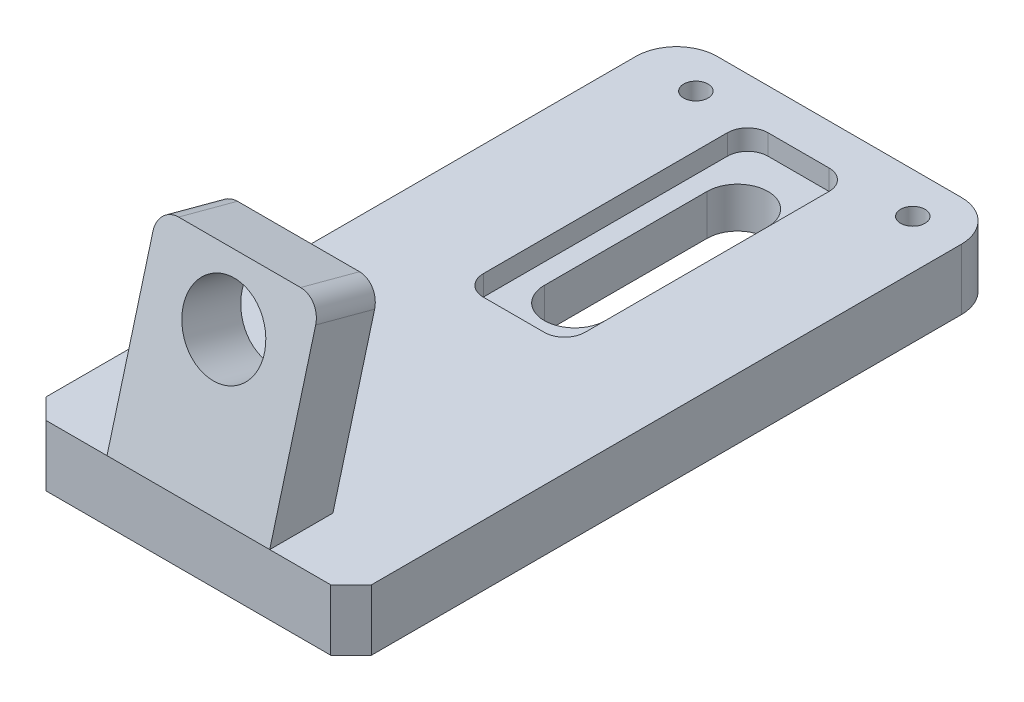
ISO-10303-21;
HEADER;
FILE_DESCRIPTION(('STEP AP214'),'2;1');
FILE_NAME('part.step','',(''),(''),'','','');
FILE_SCHEMA(('AUTOMOTIVE_DESIGN { 1 0 10303 214 1 1 1 1 }'));
ENDSEC;
DATA;
#1=APPLICATION_CONTEXT('core data for automotive mechanical design processes');
#2=APPLICATION_PROTOCOL_DEFINITION('international standard','automotive_design',2000,#1);
#3=PRODUCT_CONTEXT('',#1,'mechanical');
#4=PRODUCT('Part','Part','',(#3));
#5=PRODUCT_RELATED_PRODUCT_CATEGORY('part','',(#4));
#6=PRODUCT_DEFINITION_FORMATION('','',#4);
#7=PRODUCT_DEFINITION_CONTEXT('part definition',#1,'design');
#8=PRODUCT_DEFINITION('design','',#6,#7);
#9=PRODUCT_DEFINITION_SHAPE('','',#8);
#10=(LENGTH_UNIT() NAMED_UNIT(*) SI_UNIT(.MILLI.,.METRE.));
#11=(NAMED_UNIT(*) PLANE_ANGLE_UNIT() SI_UNIT($,.RADIAN.));
#12=(NAMED_UNIT(*) SI_UNIT($,.STERADIAN.) SOLID_ANGLE_UNIT());
#13=UNCERTAINTY_MEASURE_WITH_UNIT(LENGTH_MEASURE(1.E-05),#10,'distance_accuracy_value','');
#14=(GEOMETRIC_REPRESENTATION_CONTEXT(3) GLOBAL_UNCERTAINTY_ASSIGNED_CONTEXT((#13)) GLOBAL_UNIT_ASSIGNED_CONTEXT((#10,
#11,#12)) REPRESENTATION_CONTEXT('',''));
#15=CARTESIAN_POINT('',(0.,0.,0.));
#16=DIRECTION('',(0.,0.,1.));
#17=DIRECTION('',(1.,0.,0.));
#18=AXIS2_PLACEMENT_3D('',#15,#16,#17);
#19=CARTESIAN_POINT('',(-20.,15.,0.));
#20=DIRECTION('',(0.,1.,0.));
#21=DIRECTION('',(0.,0.,1.));
#22=AXIS2_PLACEMENT_3D('',#19,#20,#21);
#23=PLANE('',#22);
#24=DIRECTION('',(1.,0.,0.));
#25=VECTOR('',#24,1.);
#26=CARTESIAN_POINT('',(-20.,15.,64.4708572938488));
#27=LINE('',#26,#25);
#28=CARTESIAN_POINT('',(-20.,15.,64.4708572938488));
#29=VERTEX_POINT('',#28);
#30=CARTESIAN_POINT('',(20.,15.,64.4708572938488));
#31=VERTEX_POINT('',#30);
#32=EDGE_CURVE('E102',#29,#31,#27,.T.);
#33=ORIENTED_EDGE('',*,*,#32,.T.);
#34=DIRECTION('',(0.,0.,1.));
#35=VECTOR('',#34,1.);
#36=CARTESIAN_POINT('',(20.,15.,0.));
#37=LINE('',#36,#35);
#38=CARTESIAN_POINT('',(20.,15.,80.));
#39=VERTEX_POINT('',#38);
#40=EDGE_CURVE('E108',#31,#39,#37,.T.);
#41=ORIENTED_EDGE('',*,*,#40,.T.);
#42=DIRECTION('',(1.,0.,0.));
#43=VECTOR('',#42,1.);
#44=CARTESIAN_POINT('',(-20.,15.,80.));
#45=LINE('',#44,#43);
#46=CARTESIAN_POINT('',(-20.,15.,80.));
#47=VERTEX_POINT('',#46);
#48=EDGE_CURVE('E132',#47,#39,#45,.T.);
#49=ORIENTED_EDGE('',*,*,#48,.F.);
#50=DIRECTION('',(0.,0.,1.));
#51=VECTOR('',#50,1.);
#52=CARTESIAN_POINT('',(-20.,15.,0.));
#53=LINE('',#52,#51);
#54=EDGE_CURVE('E114',#29,#47,#53,.T.);
#55=ORIENTED_EDGE('',*,*,#54,.F.);
#56=EDGE_LOOP('',(#33,#41,#49,#55));
#57=FACE_BOUND('',#56,.T.);
#58=ADVANCED_FACE('F45',(#57),#23,.F.);
#59=CARTESIAN_POINT('',(-20.,21.0048094716165,78.3910161513777));
#60=DIRECTION('',(0.,-0.258819045102518,-0.965925826289069));
#61=DIRECTION('',(0.,0.965925826289069,-0.258819045102518));
#62=AXIS2_PLACEMENT_3D('',#59,#60,#61);
#63=PLANE('',#62);
#64=CARTESIAN_POINT('',(0.,47.511112605664,71.2886736322752));
#65=DIRECTION('',(0.,0.258819045102518,0.965925826289069));
#66=DIRECTION('',(0.,-0.965925826289069,0.258819045102518));
#67=AXIS2_PLACEMENT_3D('',#64,#65,#66);
#68=CIRCLE('',#67,10.);
#69=CARTESIAN_POINT('',(0.,37.8518543427733,73.8768640833004));
#70=VERTEX_POINT('',#69);
#71=EDGE_CURVE('E122',#70,#70,#68,.T.);
#72=ORIENTED_EDGE('',*,*,#71,.F.);
#73=EDGE_LOOP('',(#72));
#74=FACE_BOUND('',#73,.T.);
#75=DIRECTION('',(1.,0.,0.));
#76=VECTOR('',#75,1.);
#77=CARTESIAN_POINT('',(-20.,62.,67.4063879557374));
#78=LINE('',#77,#76);
#79=CARTESIAN_POINT('',(-15.,62.,67.4063879557374));
#80=VERTEX_POINT('',#79);
#81=CARTESIAN_POINT('',(15.,62.,67.4063879557374));
#82=VERTEX_POINT('',#81);
#83=EDGE_CURVE('E135',#80,#82,#78,.T.);
#84=ORIENTED_EDGE('',*,*,#83,.F.);
#85=CARTESIAN_POINT('',(-15.,57.1703708685546,68.70048318125));
#86=DIRECTION('',(0.,-0.258819045102518,-0.965925826289069));
#87=DIRECTION('',(0.,0.965925826289069,-0.258819045102518));
#88=AXIS2_PLACEMENT_3D('',#85,#86,#87);
#89=CIRCLE('',#88,5.);
#90=CARTESIAN_POINT('',(-20.,57.1703708685547,68.70048318125));
#91=VERTEX_POINT('',#90);
#92=EDGE_CURVE('E53',#80,#91,#89,.F.);
#93=ORIENTED_EDGE('',*,*,#92,.T.);
#94=DIRECTION('',(0.,0.965925826289069,-0.258819045102518));
#95=VECTOR('',#94,1.);
#96=CARTESIAN_POINT('',(-20.,21.0048094716165,78.3910161513777));
#97=LINE('',#96,#95);
#98=EDGE_CURVE('E116',#47,#91,#97,.T.);
#99=ORIENTED_EDGE('',*,*,#98,.F.);
#100=ORIENTED_EDGE('',*,*,#48,.T.);
#101=DIRECTION('',(0.,0.965925826289069,-0.258819045102518));
#102=VECTOR('',#101,1.);
#103=CARTESIAN_POINT('',(20.,21.0048094716165,78.3910161513777));
#104=LINE('',#103,#102);
#105=CARTESIAN_POINT('',(20.,57.1703708685547,68.70048318125));
#106=VERTEX_POINT('',#105);
#107=EDGE_CURVE('E107',#39,#106,#104,.T.);
#108=ORIENTED_EDGE('',*,*,#107,.T.);
#109=CARTESIAN_POINT('',(15.,57.1703708685547,68.70048318125));
#110=DIRECTION('',(0.,-0.258819045102518,-0.965925826289069));
#111=DIRECTION('',(0.,0.965925826289069,-0.258819045102518));
#112=AXIS2_PLACEMENT_3D('',#109,#110,#111);
#113=CIRCLE('',#112,5.);
#114=EDGE_CURVE('E65',#106,#82,#113,.F.);
#115=ORIENTED_EDGE('',*,*,#114,.T.);
#116=EDGE_LOOP('',(#84,#93,#99,#100,#108,#115));
#117=FACE_BOUND('',#116,.T.);
#118=ADVANCED_FACE('F149',(#74,#117),#63,.F.);
#119=CARTESIAN_POINT('',(-20.,40.9951905283836,-10.9846281956402));
#120=DIRECTION('',(0.,-0.965925826289069,0.258819045102517));
#121=DIRECTION('',(0.,-0.258819045102517,-0.965925826289069));
#122=AXIS2_PLACEMENT_3D('',#119,#120,#121);
#123=PLANE('',#122);
#124=DIRECTION('',(1.,0.,0.));
#125=VECTOR('',#124,1.);
#126=CARTESIAN_POINT('',(-20.,58.1177143234622,52.9175005614014));
#127=LINE('',#126,#125);
#128=CARTESIAN_POINT('',(-15.,58.1177143234622,52.9175005614014));
#129=VERTEX_POINT('',#128);
#130=CARTESIAN_POINT('',(15.,58.1177143234622,52.9175005614014));
#131=VERTEX_POINT('',#130);
#132=EDGE_CURVE('E115',#129,#131,#127,.T.);
#133=ORIENTED_EDGE('',*,*,#132,.F.);
#134=DIRECTION('',(0.,-0.258819045102517,-0.965925826289069));
#135=VECTOR('',#134,1.);
#136=CARTESIAN_POINT('',(-15.,40.9951905283836,-10.9846281956402));
#137=LINE('',#136,#135);
#138=EDGE_CURVE('E146',#129,#80,#137,.F.);
#139=ORIENTED_EDGE('',*,*,#138,.T.);
#140=ORIENTED_EDGE('',*,*,#83,.T.);
#141=DIRECTION('',(0.,-0.258819045102517,-0.965925826289069));
#142=VECTOR('',#141,1.);
#143=CARTESIAN_POINT('',(15.,58.1177143234622,52.9175005614014));
#144=LINE('',#143,#142);
#145=EDGE_CURVE('E143',#82,#131,#144,.T.);
#146=ORIENTED_EDGE('',*,*,#145,.T.);
#147=EDGE_LOOP('',(#133,#139,#140,#146));
#148=FACE_BOUND('',#147,.T.);
#149=ADVANCED_FACE('F158',(#148),#123,.F.);
#150=CARTESIAN_POINT('',(-20.,17.1225237950787,63.9021287570416));
#151=DIRECTION('',(0.,0.258819045102517,0.965925826289069));
#152=DIRECTION('',(0.,-0.965925826289069,0.258819045102517));
#153=AXIS2_PLACEMENT_3D('',#150,#151,#152);
#154=PLANE('',#153);
#155=CARTESIAN_POINT('',(0.,43.6288269291262,56.7997862379391));
#156=DIRECTION('',(0.,0.258819045102517,0.965925826289069));
#157=DIRECTION('',(0.,-0.965925826289069,0.258819045102517));
#158=AXIS2_PLACEMENT_3D('',#155,#156,#157);
#159=CIRCLE('',#158,10.);
#160=CARTESIAN_POINT('',(0.,33.9695686662355,59.3879766889643));
#161=VERTEX_POINT('',#160);
#162=EDGE_CURVE('E119',#161,#161,#159,.T.);
#163=ORIENTED_EDGE('',*,*,#162,.T.);
#164=EDGE_LOOP('',(#163));
#165=FACE_BOUND('',#164,.T.);
#166=DIRECTION('',(0.,-0.965925826289069,0.258819045102517));
#167=VECTOR('',#166,1.);
#168=CARTESIAN_POINT('',(-20.,17.1225237950787,63.9021287570416));
#169=LINE('',#168,#167);
#170=CARTESIAN_POINT('',(-20.,53.2880851920169,54.211595786914));
#171=VERTEX_POINT('',#170);
#172=EDGE_CURVE('E128',#171,#29,#169,.T.);
#173=ORIENTED_EDGE('',*,*,#172,.F.);
#174=CARTESIAN_POINT('',(-15.,53.2880851920169,54.211595786914));
#175=DIRECTION('',(0.,0.258819045102517,0.965925826289069));
#176=DIRECTION('',(0.,-0.965925826289069,0.258819045102517));
#177=AXIS2_PLACEMENT_3D('',#174,#175,#176);
#178=CIRCLE('',#177,5.);
#179=EDGE_CURVE('E141',#171,#129,#178,.F.);
#180=ORIENTED_EDGE('',*,*,#179,.T.);
#181=ORIENTED_EDGE('',*,*,#132,.T.);
#182=CARTESIAN_POINT('',(15.,53.2880851920169,54.211595786914));
#183=DIRECTION('',(0.,0.258819045102517,0.965925826289069));
#184=DIRECTION('',(0.,-0.965925826289069,0.258819045102517));
#185=AXIS2_PLACEMENT_3D('',#182,#183,#184);
#186=CIRCLE('',#185,5.);
#187=CARTESIAN_POINT('',(20.,53.2880851920169,54.211595786914));
#188=VERTEX_POINT('',#187);
#189=EDGE_CURVE('E105',#131,#188,#186,.F.);
#190=ORIENTED_EDGE('',*,*,#189,.T.);
#191=DIRECTION('',(0.,-0.965925826289069,0.258819045102517));
#192=VECTOR('',#191,1.);
#193=CARTESIAN_POINT('',(20.,17.1225237950787,63.9021287570416));
#194=LINE('',#193,#192);
#195=EDGE_CURVE('E98',#188,#31,#194,.T.);
#196=ORIENTED_EDGE('',*,*,#195,.T.);
#197=ORIENTED_EDGE('',*,*,#32,.F.);
#198=EDGE_LOOP('',(#173,#180,#181,#190,#196,#197));
#199=FACE_BOUND('',#198,.T.);
#200=ADVANCED_FACE('F101',(#165,#199),#154,.F.);
#201=CARTESIAN_POINT('',(-20.,0.,0.));
#202=DIRECTION('',(1.,0.,0.));
#203=DIRECTION('',(0.,0.,-1.));
#204=AXIS2_PLACEMENT_3D('',#201,#202,#203);
#205=PLANE('',#204);
#206=ORIENTED_EDGE('',*,*,#98,.T.);
#207=DIRECTION('',(0.,-0.258819045102517,-0.965925826289069));
#208=VECTOR('',#207,1.);
#209=CARTESIAN_POINT('',(-20.,36.1655613969382,-9.69053297012764));
#210=LINE('',#209,#208);
#211=EDGE_CURVE('E134',#91,#171,#210,.T.);
#212=ORIENTED_EDGE('',*,*,#211,.T.);
#213=ORIENTED_EDGE('',*,*,#172,.T.);
#214=ORIENTED_EDGE('',*,*,#54,.T.);
#215=EDGE_LOOP('',(#206,#212,#213,#214));
#216=FACE_BOUND('',#215,.T.);
#217=ADVANCED_FACE('F154',(#216),#205,.F.);
#218=CARTESIAN_POINT('',(20.,0.,0.));
#219=DIRECTION('',(1.,0.,0.));
#220=DIRECTION('',(0.,0.,-1.));
#221=AXIS2_PLACEMENT_3D('',#218,#219,#220);
#222=PLANE('',#221);
#223=ORIENTED_EDGE('',*,*,#195,.F.);
#224=DIRECTION('',(0.,-0.258819045102517,-0.965925826289069));
#225=VECTOR('',#224,1.);
#226=CARTESIAN_POINT('',(20.,57.1703708685547,68.70048318125));
#227=LINE('',#226,#225);
#228=EDGE_CURVE('E12',#188,#106,#227,.F.);
#229=ORIENTED_EDGE('',*,*,#228,.T.);
#230=ORIENTED_EDGE('',*,*,#107,.F.);
#231=ORIENTED_EDGE('',*,*,#40,.F.);
#232=EDGE_LOOP('',(#223,#229,#230,#231));
#233=FACE_BOUND('',#232,.T.);
#234=ADVANCED_FACE('F118',(#233),#222,.T.);
#235=CARTESIAN_POINT('',(0.,42.3347317036136,51.9701571064938));
#236=DIRECTION('',(0.,0.258819045102518,0.965925826289069));
#237=DIRECTION('',(0.,-0.965925826289069,0.258819045102518));
#238=AXIS2_PLACEMENT_3D('',#235,#236,#237);
#239=CYLINDRICAL_SURFACE('',#238,10.);
#240=ORIENTED_EDGE('',*,*,#71,.T.);
#241=EDGE_LOOP('',(#240));
#242=FACE_BOUND('',#241,.T.);
#243=ORIENTED_EDGE('',*,*,#162,.F.);
#244=EDGE_LOOP('',(#243));
#245=FACE_BOUND('',#244,.T.);
#246=ADVANCED_FACE('F165',(#242,#245),#239,.F.);
#247=CARTESIAN_POINT('',(-15.,36.1655613969382,-9.69053297012764));
#248=DIRECTION('',(0.,-0.258819045102517,-0.965925826289069));
#249=DIRECTION('',(0.,0.965925826289069,-0.258819045102517));
#250=AXIS2_PLACEMENT_3D('',#247,#248,#249);
#251=CYLINDRICAL_SURFACE('',#250,5.);
#252=ORIENTED_EDGE('',*,*,#92,.F.);
#253=ORIENTED_EDGE('',*,*,#138,.F.);
#254=ORIENTED_EDGE('',*,*,#179,.F.);
#255=ORIENTED_EDGE('',*,*,#211,.F.);
#256=EDGE_LOOP('',(#252,#253,#254,#255));
#257=FACE_BOUND('',#256,.T.);
#258=ADVANCED_FACE('F155',(#257),#251,.T.);
#259=CARTESIAN_POINT('',(15.,36.1655613969382,-9.69053297012764));
#260=DIRECTION('',(0.,0.258819045102517,0.965925826289069));
#261=DIRECTION('',(0.,-0.965925826289069,0.258819045102517));
#262=AXIS2_PLACEMENT_3D('',#259,#260,#261);
#263=CYLINDRICAL_SURFACE('',#262,5.);
#264=ORIENTED_EDGE('',*,*,#114,.F.);
#265=ORIENTED_EDGE('',*,*,#228,.F.);
#266=ORIENTED_EDGE('',*,*,#189,.F.);
#267=ORIENTED_EDGE('',*,*,#145,.F.);
#268=EDGE_LOOP('',(#264,#265,#266,#267));
#269=FACE_BOUND('',#268,.T.);
#270=ADVANCED_FACE('F47',(#269),#263,.T.);
#271=CLOSED_SHELL('',(#58,#118,#149,#200,#217,#234,#246,#258,#270));
#272=MANIFOLD_SOLID_BREP('B2',#271);
#273=CARTESIAN_POINT('',(0.,15.,-15.));
#274=DIRECTION('',(0.,-1.,0.));
#275=DIRECTION('',(0.,0.,-1.));
#276=AXIS2_PLACEMENT_3D('',#273,#274,#275);
#277=CYLINDRICAL_SURFACE('',#276,7.5);
#278=DIRECTION('',(0.,-1.,0.));
#279=VECTOR('',#278,1.);
#280=CARTESIAN_POINT('',(-7.5,15.,-15.));
#281=LINE('',#280,#279);
#282=CARTESIAN_POINT('',(-7.5,10.,-15.));
#283=VERTEX_POINT('',#282);
#284=CARTESIAN_POINT('',(-7.5,0.,-15.));
#285=VERTEX_POINT('',#284);
#286=EDGE_CURVE('E492',#283,#285,#281,.T.);
#287=ORIENTED_EDGE('',*,*,#286,.F.);
#288=CARTESIAN_POINT('',(0.,10.,-15.));
#289=DIRECTION('',(0.,1.,0.));
#290=DIRECTION('',(0.,0.,1.));
#291=AXIS2_PLACEMENT_3D('',#288,#289,#290);
#292=CIRCLE('',#291,7.5);
#293=CARTESIAN_POINT('',(7.5,10.,-15.));
#294=VERTEX_POINT('',#293);
#295=EDGE_CURVE('E265',#283,#294,#292,.T.);
#296=ORIENTED_EDGE('',*,*,#295,.T.);
#297=DIRECTION('',(0.,-1.,0.));
#298=VECTOR('',#297,1.);
#299=CARTESIAN_POINT('',(7.5,15.,-15.));
#300=LINE('',#299,#298);
#301=CARTESIAN_POINT('',(7.5,0.,-15.));
#302=VERTEX_POINT('',#301);
#303=EDGE_CURVE('E498',#294,#302,#300,.T.);
#304=ORIENTED_EDGE('',*,*,#303,.T.);
#305=CARTESIAN_POINT('',(0.,0.,-15.));
#306=DIRECTION('',(0.,1.,0.));
#307=DIRECTION('',(0.,0.,1.));
#308=AXIS2_PLACEMENT_3D('',#305,#306,#307);
#309=CIRCLE('',#308,7.5);
#310=EDGE_CURVE('E480',#285,#302,#309,.T.);
#311=ORIENTED_EDGE('',*,*,#310,.F.);
#312=EDGE_LOOP('',(#287,#296,#304,#311));
#313=FACE_BOUND('',#312,.T.);
#314=ADVANCED_FACE('F242',(#313),#277,.F.);
#315=CARTESIAN_POINT('',(7.5,15.,-15.));
#316=DIRECTION('',(-1.,0.,0.));
#317=DIRECTION('',(0.,0.,1.));
#318=AXIS2_PLACEMENT_3D('',#315,#316,#317);
#319=PLANE('',#318);
#320=ORIENTED_EDGE('',*,*,#303,.F.);
#321=DIRECTION('',(0.,0.,-1.));
#322=VECTOR('',#321,1.);
#323=CARTESIAN_POINT('',(7.5,10.,-15.));
#324=LINE('',#323,#322);
#325=CARTESIAN_POINT('',(7.5,10.,-55.));
#326=VERTEX_POINT('',#325);
#327=EDGE_CURVE('E476',#294,#326,#324,.T.);
#328=ORIENTED_EDGE('',*,*,#327,.T.);
#329=DIRECTION('',(0.,-1.,0.));
#330=VECTOR('',#329,1.);
#331=CARTESIAN_POINT('',(7.5,15.,-55.));
#332=LINE('',#331,#330);
#333=CARTESIAN_POINT('',(7.5,0.,-55.));
#334=VERTEX_POINT('',#333);
#335=EDGE_CURVE('E496',#326,#334,#332,.T.);
#336=ORIENTED_EDGE('',*,*,#335,.T.);
#337=DIRECTION('',(0.,0.,-1.));
#338=VECTOR('',#337,1.);
#339=CARTESIAN_POINT('',(7.5,0.,-15.));
#340=LINE('',#339,#338);
#341=EDGE_CURVE('E483',#302,#334,#340,.T.);
#342=ORIENTED_EDGE('',*,*,#341,.F.);
#343=EDGE_LOOP('',(#320,#328,#336,#342));
#344=FACE_BOUND('',#343,.T.);
#345=ADVANCED_FACE('F606',(#344),#319,.T.);
#346=CARTESIAN_POINT('',(0.,15.,-55.));
#347=DIRECTION('',(0.,-1.,0.));
#348=DIRECTION('',(0.,0.,-1.));
#349=AXIS2_PLACEMENT_3D('',#346,#347,#348);
#350=CYLINDRICAL_SURFACE('',#349,7.5);
#351=ORIENTED_EDGE('',*,*,#335,.F.);
#352=CARTESIAN_POINT('',(0.,10.,-55.));
#353=DIRECTION('',(0.,1.,0.));
#354=DIRECTION('',(0.,0.,1.));
#355=AXIS2_PLACEMENT_3D('',#352,#353,#354);
#356=CIRCLE('',#355,7.5);
#357=CARTESIAN_POINT('',(-7.5,10.,-55.));
#358=VERTEX_POINT('',#357);
#359=EDGE_CURVE('E460',#326,#358,#356,.T.);
#360=ORIENTED_EDGE('',*,*,#359,.T.);
#361=DIRECTION('',(0.,-1.,0.));
#362=VECTOR('',#361,1.);
#363=CARTESIAN_POINT('',(-7.5,15.,-55.));
#364=LINE('',#363,#362);
#365=CARTESIAN_POINT('',(-7.5,0.,-55.));
#366=VERTEX_POINT('',#365);
#367=EDGE_CURVE('E494',#358,#366,#364,.T.);
#368=ORIENTED_EDGE('',*,*,#367,.T.);
#369=CARTESIAN_POINT('',(0.,0.,-55.));
#370=DIRECTION('',(0.,1.,0.));
#371=DIRECTION('',(0.,0.,1.));
#372=AXIS2_PLACEMENT_3D('',#369,#370,#371);
#373=CIRCLE('',#372,7.5);
#374=EDGE_CURVE('E486',#334,#366,#373,.T.);
#375=ORIENTED_EDGE('',*,*,#374,.F.);
#376=EDGE_LOOP('',(#351,#360,#368,#375));
#377=FACE_BOUND('',#376,.T.);
#378=ADVANCED_FACE('F612',(#377),#350,.F.);
#379=CARTESIAN_POINT('',(-7.5,15.,-15.));
#380=DIRECTION('',(1.,0.,0.));
#381=DIRECTION('',(0.,0.,-1.));
#382=AXIS2_PLACEMENT_3D('',#379,#380,#381);
#383=PLANE('',#382);
#384=ORIENTED_EDGE('',*,*,#367,.F.);
#385=DIRECTION('',(0.,0.,1.));
#386=VECTOR('',#385,1.);
#387=CARTESIAN_POINT('',(-7.5,10.,-15.));
#388=LINE('',#387,#386);
#389=EDGE_CURVE('E43',#358,#283,#388,.T.);
#390=ORIENTED_EDGE('',*,*,#389,.T.);
#391=ORIENTED_EDGE('',*,*,#286,.T.);
#392=DIRECTION('',(0.,0.,1.));
#393=VECTOR('',#392,1.);
#394=CARTESIAN_POINT('',(-7.5,0.,-15.));
#395=LINE('',#394,#393);
#396=EDGE_CURVE('E489',#366,#285,#395,.T.);
#397=ORIENTED_EDGE('',*,*,#396,.F.);
#398=EDGE_LOOP('',(#384,#390,#391,#397));
#399=FACE_BOUND('',#398,.T.);
#400=ADVANCED_FACE('F620',(#399),#383,.T.);
#401=CARTESIAN_POINT('',(30.,15.,-70.));
#402=DIRECTION('',(0.,-1.,0.));
#403=DIRECTION('',(0.,0.,-1.));
#404=AXIS2_PLACEMENT_3D('',#401,#402,#403);
#405=PLANE('',#404);
#406=CARTESIAN_POINT('',(-25.2460079070573,15.,-70.));
#407=DIRECTION('',(0.,1.,0.));
#408=DIRECTION('',(0.,0.,1.));
#409=AXIS2_PLACEMENT_3D('',#406,#407,#408);
#410=CIRCLE('',#409,3.);
#411=CARTESIAN_POINT('',(-25.2460079070573,15.,-67.));
#412=VERTEX_POINT('',#411);
#413=EDGE_CURVE('E906',#412,#412,#410,.T.);
#414=ORIENTED_EDGE('',*,*,#413,.F.);
#415=EDGE_LOOP('',(#414));
#416=FACE_BOUND('',#415,.T.);
#417=CARTESIAN_POINT('',(28.087325426276,15.,-70.));
#418=DIRECTION('',(0.,1.,0.));
#419=DIRECTION('',(0.,0.,1.));
#420=AXIS2_PLACEMENT_3D('',#417,#418,#419);
#421=CIRCLE('',#420,3.);
#422=CARTESIAN_POINT('',(28.087325426276,15.,-67.));
#423=VERTEX_POINT('',#422);
#424=EDGE_CURVE('E392',#423,#423,#421,.T.);
#425=ORIENTED_EDGE('',*,*,#424,.F.);
#426=EDGE_LOOP('',(#425));
#427=FACE_BOUND('',#426,.T.);
#428=DIRECTION('',(0.,0.,1.));
#429=VECTOR('',#428,1.);
#430=CARTESIAN_POINT('',(-12.5,15.,-65.));
#431=LINE('',#430,#429);
#432=CARTESIAN_POINT('',(-12.5,15.,-65.));
#433=VERTEX_POINT('',#432);
#434=CARTESIAN_POINT('',(-12.5,15.,-4.99999999999999));
#435=VERTEX_POINT('',#434);
#436=EDGE_CURVE('E438',#433,#435,#431,.T.);
#437=ORIENTED_EDGE('',*,*,#436,.F.);
#438=CARTESIAN_POINT('',(-7.50000000000001,15.,-65.));
#439=DIRECTION('',(0.,1.,0.));
#440=DIRECTION('',(0.,0.,1.));
#441=AXIS2_PLACEMENT_3D('',#438,#439,#440);
#442=CIRCLE('',#441,5.00000000000001);
#443=CARTESIAN_POINT('',(-7.50000000000001,15.,-70.));
#444=VERTEX_POINT('',#443);
#445=EDGE_CURVE('E257',#444,#433,#442,.T.);
#446=ORIENTED_EDGE('',*,*,#445,.F.);
#447=DIRECTION('',(-1.,0.,0.));
#448=VECTOR('',#447,1.);
#449=CARTESIAN_POINT('',(-7.50000000000001,15.,-70.));
#450=LINE('',#449,#448);
#451=CARTESIAN_POINT('',(7.49999999999999,15.,-70.));
#452=VERTEX_POINT('',#451);
#453=EDGE_CURVE('E415',#452,#444,#450,.T.);
#454=ORIENTED_EDGE('',*,*,#453,.F.);
#455=CARTESIAN_POINT('',(7.49999999999999,15.,-65.));
#456=DIRECTION('',(0.,1.,0.));
#457=DIRECTION('',(0.,0.,-1.));
#458=AXIS2_PLACEMENT_3D('',#455,#456,#457);
#459=CIRCLE('',#458,5.00000000000001);
#460=CARTESIAN_POINT('',(12.5,15.,-65.));
#461=VERTEX_POINT('',#460);
#462=EDGE_CURVE('E453',#461,#452,#459,.T.);
#463=ORIENTED_EDGE('',*,*,#462,.F.);
#464=DIRECTION('',(0.,0.,-1.));
#465=VECTOR('',#464,1.);
#466=CARTESIAN_POINT('',(12.5,15.,-65.));
#467=LINE('',#466,#465);
#468=CARTESIAN_POINT('',(12.5,15.,-4.99999999999999));
#469=VERTEX_POINT('',#468);
#470=EDGE_CURVE('E450',#469,#461,#467,.T.);
#471=ORIENTED_EDGE('',*,*,#470,.F.);
#472=CARTESIAN_POINT('',(7.5,15.,-4.99999999999999));
#473=DIRECTION('',(0.,1.,0.));
#474=DIRECTION('',(0.,0.,1.));
#475=AXIS2_PLACEMENT_3D('',#472,#473,#474);
#476=CIRCLE('',#475,5.);
#477=CARTESIAN_POINT('',(7.5,15.,0.));
#478=VERTEX_POINT('',#477);
#479=EDGE_CURVE('E447',#478,#469,#476,.T.);
#480=ORIENTED_EDGE('',*,*,#479,.F.);
#481=DIRECTION('',(1.,0.,0.));
#482=VECTOR('',#481,1.);
#483=CARTESIAN_POINT('',(-7.5,15.,0.));
#484=LINE('',#483,#482);
#485=CARTESIAN_POINT('',(-7.5,15.,0.));
#486=VERTEX_POINT('',#485);
#487=EDGE_CURVE('E444',#486,#478,#484,.T.);
#488=ORIENTED_EDGE('',*,*,#487,.F.);
#489=CARTESIAN_POINT('',(-7.5,15.,-4.99999999999999));
#490=DIRECTION('',(0.,1.,0.));
#491=DIRECTION('',(0.,0.,1.));
#492=AXIS2_PLACEMENT_3D('',#489,#490,#491);
#493=CIRCLE('',#492,5.);
#494=EDGE_CURVE('E441',#435,#486,#493,.T.);
#495=ORIENTED_EDGE('',*,*,#494,.F.);
#496=EDGE_LOOP('',(#437,#446,#454,#463,#471,#480,#488,#495));
#497=FACE_BOUND('',#496,.T.);
#498=DIRECTION('',(1.,0.,0.));
#499=VECTOR('',#498,1.);
#500=CARTESIAN_POINT('',(-35.,15.,80.));
#501=LINE('',#500,#499);
#502=CARTESIAN_POINT('',(-35.,15.,80.));
#503=VERTEX_POINT('',#502);
#504=CARTESIAN_POINT('',(35.,15.,80.));
#505=VERTEX_POINT('',#504);
#506=EDGE_CURVE('E501',#503,#505,#501,.T.);
#507=ORIENTED_EDGE('',*,*,#506,.T.);
#508=DIRECTION('',(0.707106781186549,0.,-0.707106781186546));
#509=VECTOR('',#508,1.);
#510=CARTESIAN_POINT('',(35.,15.,80.));
#511=LINE('',#510,#509);
#512=CARTESIAN_POINT('',(40.,15.,75.));
#513=VERTEX_POINT('',#512);
#514=EDGE_CURVE('E504',#505,#513,#511,.T.);
#515=ORIENTED_EDGE('',*,*,#514,.T.);
#516=DIRECTION('',(0.,0.,-1.));
#517=VECTOR('',#516,1.);
#518=CARTESIAN_POINT('',(40.,15.,75.));
#519=LINE('',#518,#517);
#520=CARTESIAN_POINT('',(40.,15.,-69.9999999999999));
#521=VERTEX_POINT('',#520);
#522=EDGE_CURVE('E507',#513,#521,#519,.T.);
#523=ORIENTED_EDGE('',*,*,#522,.T.);
#524=CARTESIAN_POINT('',(30.,15.,-70.));
#525=DIRECTION('',(0.,1.,0.));
#526=DIRECTION('',(0.,0.,-1.));
#527=AXIS2_PLACEMENT_3D('',#524,#525,#526);
#528=CIRCLE('',#527,10.);
#529=CARTESIAN_POINT('',(29.9999999999999,15.,-80.));
#530=VERTEX_POINT('',#529);
#531=EDGE_CURVE('E509',#521,#530,#528,.T.);
#532=ORIENTED_EDGE('',*,*,#531,.T.);
#533=DIRECTION('',(-1.,0.,0.));
#534=VECTOR('',#533,1.);
#535=CARTESIAN_POINT('',(-29.9999999999999,15.,-80.));
#536=LINE('',#535,#534);
#537=CARTESIAN_POINT('',(-29.9999999999999,15.,-80.));
#538=VERTEX_POINT('',#537);
#539=EDGE_CURVE('E511',#530,#538,#536,.T.);
#540=ORIENTED_EDGE('',*,*,#539,.T.);
#541=CARTESIAN_POINT('',(-30.,15.,-70.));
#542=DIRECTION('',(0.,1.,0.));
#543=DIRECTION('',(0.,0.,-1.));
#544=AXIS2_PLACEMENT_3D('',#541,#542,#543);
#545=CIRCLE('',#544,10.);
#546=CARTESIAN_POINT('',(-40.,15.,-69.9999999999999));
#547=VERTEX_POINT('',#546);
#548=EDGE_CURVE('E513',#538,#547,#545,.T.);
#549=ORIENTED_EDGE('',*,*,#548,.T.);
#550=DIRECTION('',(0.,0.,1.));
#551=VECTOR('',#550,1.);
#552=CARTESIAN_POINT('',(-40.,15.,75.));
#553=LINE('',#552,#551);
#554=CARTESIAN_POINT('',(-40.,15.,75.));
#555=VERTEX_POINT('',#554);
#556=EDGE_CURVE('E515',#547,#555,#553,.T.);
#557=ORIENTED_EDGE('',*,*,#556,.T.);
#558=DIRECTION('',(0.707106781186547,0.,0.707106781186548));
#559=VECTOR('',#558,1.);
#560=CARTESIAN_POINT('',(-40.,15.,75.));
#561=LINE('',#560,#559);
#562=EDGE_CURVE('E517',#555,#503,#561,.T.);
#563=ORIENTED_EDGE('',*,*,#562,.T.);
#564=EDGE_LOOP('',(#507,#515,#523,#532,#540,#549,#557,#563));
#565=FACE_BOUND('',#564,.T.);
#566=ADVANCED_FACE('F581',(#416,#427,#497,#565),#405,.F.);
#567=CARTESIAN_POINT('',(30.,0.,-70.));
#568=DIRECTION('',(0.,-1.,0.));
#569=DIRECTION('',(0.,0.,-1.));
#570=AXIS2_PLACEMENT_3D('',#567,#568,#569);
#571=PLANE('',#570);
#572=DIRECTION('',(1.,0.,0.));
#573=VECTOR('',#572,1.);
#574=CARTESIAN_POINT('',(-35.,0.,80.));
#575=LINE('',#574,#573);
#576=CARTESIAN_POINT('',(-35.,0.,80.));
#577=VERTEX_POINT('',#576);
#578=CARTESIAN_POINT('',(35.,0.,80.));
#579=VERTEX_POINT('',#578);
#580=EDGE_CURVE('E500',#577,#579,#575,.T.);
#581=ORIENTED_EDGE('',*,*,#580,.F.);
#582=DIRECTION('',(0.707106781186547,0.,0.707106781186548));
#583=VECTOR('',#582,1.);
#584=CARTESIAN_POINT('',(-40.,0.,75.));
#585=LINE('',#584,#583);
#586=CARTESIAN_POINT('',(-40.,0.,75.));
#587=VERTEX_POINT('',#586);
#588=EDGE_CURVE('E505',#587,#577,#585,.T.);
#589=ORIENTED_EDGE('',*,*,#588,.F.);
#590=DIRECTION('',(0.,0.,1.));
#591=VECTOR('',#590,1.);
#592=CARTESIAN_POINT('',(-40.,0.,75.));
#593=LINE('',#592,#591);
#594=CARTESIAN_POINT('',(-40.,0.,-69.9999999999999));
#595=VERTEX_POINT('',#594);
#596=EDGE_CURVE('E532',#595,#587,#593,.T.);
#597=ORIENTED_EDGE('',*,*,#596,.F.);
#598=CARTESIAN_POINT('',(-30.,0.,-70.));
#599=DIRECTION('',(0.,1.,0.));
#600=DIRECTION('',(0.,0.,-1.));
#601=AXIS2_PLACEMENT_3D('',#598,#599,#600);
#602=CIRCLE('',#601,10.);
#603=CARTESIAN_POINT('',(-29.9999999999999,0.,-80.));
#604=VERTEX_POINT('',#603);
#605=EDGE_CURVE('E530',#604,#595,#602,.T.);
#606=ORIENTED_EDGE('',*,*,#605,.F.);
#607=DIRECTION('',(-1.,0.,0.));
#608=VECTOR('',#607,1.);
#609=CARTESIAN_POINT('',(-29.9999999999999,0.,-80.));
#610=LINE('',#609,#608);
#611=CARTESIAN_POINT('',(29.9999999999999,0.,-80.));
#612=VERTEX_POINT('',#611);
#613=EDGE_CURVE('E528',#612,#604,#610,.T.);
#614=ORIENTED_EDGE('',*,*,#613,.F.);
#615=CARTESIAN_POINT('',(30.,0.,-70.));
#616=DIRECTION('',(0.,1.,0.));
#617=DIRECTION('',(0.,0.,-1.));
#618=AXIS2_PLACEMENT_3D('',#615,#616,#617);
#619=CIRCLE('',#618,10.);
#620=CARTESIAN_POINT('',(40.,0.,-69.9999999999999));
#621=VERTEX_POINT('',#620);
#622=EDGE_CURVE('E526',#621,#612,#619,.T.);
#623=ORIENTED_EDGE('',*,*,#622,.F.);
#624=DIRECTION('',(0.,0.,-1.));
#625=VECTOR('',#624,1.);
#626=CARTESIAN_POINT('',(40.,0.,75.));
#627=LINE('',#626,#625);
#628=CARTESIAN_POINT('',(40.,0.,75.));
#629=VERTEX_POINT('',#628);
#630=EDGE_CURVE('E524',#629,#621,#627,.T.);
#631=ORIENTED_EDGE('',*,*,#630,.F.);
#632=DIRECTION('',(0.707106781186549,0.,-0.707106781186546));
#633=VECTOR('',#632,1.);
#634=CARTESIAN_POINT('',(35.,0.,80.));
#635=LINE('',#634,#633);
#636=EDGE_CURVE('E522',#579,#629,#635,.T.);
#637=ORIENTED_EDGE('',*,*,#636,.F.);
#638=EDGE_LOOP('',(#581,#589,#597,#606,#614,#623,#631,#637));
#639=FACE_BOUND('',#638,.T.);
#640=ORIENTED_EDGE('',*,*,#396,.T.);
#641=ORIENTED_EDGE('',*,*,#310,.T.);
#642=ORIENTED_EDGE('',*,*,#341,.T.);
#643=ORIENTED_EDGE('',*,*,#374,.T.);
#644=EDGE_LOOP('',(#640,#641,#642,#643));
#645=FACE_BOUND('',#644,.T.);
#646=ADVANCED_FACE('F565',(#639,#645),#571,.T.);
#647=CARTESIAN_POINT('',(-35.,15.,80.));
#648=DIRECTION('',(0.,0.,-1.));
#649=DIRECTION('',(-1.,0.,0.));
#650=AXIS2_PLACEMENT_3D('',#647,#648,#649);
#651=PLANE('',#650);
#652=ORIENTED_EDGE('',*,*,#580,.T.);
#653=DIRECTION('',(0.,-1.,0.));
#654=VECTOR('',#653,1.);
#655=CARTESIAN_POINT('',(35.,15.,80.));
#656=LINE('',#655,#654);
#657=EDGE_CURVE('E250',#505,#579,#656,.T.);
#658=ORIENTED_EDGE('',*,*,#657,.F.);
#659=ORIENTED_EDGE('',*,*,#506,.F.);
#660=DIRECTION('',(0.,-1.,0.));
#661=VECTOR('',#660,1.);
#662=CARTESIAN_POINT('',(-35.,15.,80.));
#663=LINE('',#662,#661);
#664=EDGE_CURVE('E519',#503,#577,#663,.T.);
#665=ORIENTED_EDGE('',*,*,#664,.T.);
#666=EDGE_LOOP('',(#652,#658,#659,#665));
#667=FACE_BOUND('',#666,.T.);
#668=ADVANCED_FACE('F244',(#667),#651,.F.);
#669=CARTESIAN_POINT('',(35.,15.,80.));
#670=DIRECTION('',(-0.707106781186546,0.,-0.707106781186549));
#671=DIRECTION('',(-0.707106781186549,0.,0.707106781186546));
#672=AXIS2_PLACEMENT_3D('',#669,#670,#671);
#673=PLANE('',#672);
#674=ORIENTED_EDGE('',*,*,#636,.T.);
#675=DIRECTION('',(0.,-1.,0.));
#676=VECTOR('',#675,1.);
#677=CARTESIAN_POINT('',(40.,15.,75.));
#678=LINE('',#677,#676);
#679=EDGE_CURVE('E552',#513,#629,#678,.T.);
#680=ORIENTED_EDGE('',*,*,#679,.F.);
#681=ORIENTED_EDGE('',*,*,#514,.F.);
#682=ORIENTED_EDGE('',*,*,#657,.T.);
#683=EDGE_LOOP('',(#674,#680,#681,#682));
#684=FACE_BOUND('',#683,.T.);
#685=ADVANCED_FACE('F557',(#684),#673,.F.);
#686=CARTESIAN_POINT('',(40.,15.,75.));
#687=DIRECTION('',(-1.,0.,0.));
#688=DIRECTION('',(0.,0.,1.));
#689=AXIS2_PLACEMENT_3D('',#686,#687,#688);
#690=PLANE('',#689);
#691=ORIENTED_EDGE('',*,*,#630,.T.);
#692=DIRECTION('',(0.,-1.,0.));
#693=VECTOR('',#692,1.);
#694=CARTESIAN_POINT('',(40.,15.,-69.9999999999999));
#695=LINE('',#694,#693);
#696=EDGE_CURVE('E549',#521,#621,#695,.T.);
#697=ORIENTED_EDGE('',*,*,#696,.F.);
#698=ORIENTED_EDGE('',*,*,#522,.F.);
#699=ORIENTED_EDGE('',*,*,#679,.T.);
#700=EDGE_LOOP('',(#691,#697,#698,#699));
#701=FACE_BOUND('',#700,.T.);
#702=ADVANCED_FACE('F573',(#701),#690,.F.);
#703=CARTESIAN_POINT('',(30.,15.,-70.));
#704=DIRECTION('',(0.,-1.,0.));
#705=DIRECTION('',(0.,0.,-1.));
#706=AXIS2_PLACEMENT_3D('',#703,#704,#705);
#707=CYLINDRICAL_SURFACE('',#706,10.);
#708=ORIENTED_EDGE('',*,*,#622,.T.);
#709=DIRECTION('',(0.,-1.,0.));
#710=VECTOR('',#709,1.);
#711=CARTESIAN_POINT('',(29.9999999999999,15.,-80.));
#712=LINE('',#711,#710);
#713=EDGE_CURVE('E546',#530,#612,#712,.T.);
#714=ORIENTED_EDGE('',*,*,#713,.F.);
#715=ORIENTED_EDGE('',*,*,#531,.F.);
#716=ORIENTED_EDGE('',*,*,#696,.T.);
#717=EDGE_LOOP('',(#708,#714,#715,#716));
#718=FACE_BOUND('',#717,.T.);
#719=ADVANCED_FACE('F577',(#718),#707,.T.);
#720=CARTESIAN_POINT('',(-29.9999999999999,15.,-80.));
#721=DIRECTION('',(0.,0.,1.));
#722=DIRECTION('',(1.,0.,0.));
#723=AXIS2_PLACEMENT_3D('',#720,#721,#722);
#724=PLANE('',#723);
#725=ORIENTED_EDGE('',*,*,#613,.T.);
#726=DIRECTION('',(0.,-1.,0.));
#727=VECTOR('',#726,1.);
#728=CARTESIAN_POINT('',(-29.9999999999999,15.,-80.));
#729=LINE('',#728,#727);
#730=EDGE_CURVE('E543',#538,#604,#729,.T.);
#731=ORIENTED_EDGE('',*,*,#730,.F.);
#732=ORIENTED_EDGE('',*,*,#539,.F.);
#733=ORIENTED_EDGE('',*,*,#713,.T.);
#734=EDGE_LOOP('',(#725,#731,#732,#733));
#735=FACE_BOUND('',#734,.T.);
#736=ADVANCED_FACE('F596',(#735),#724,.F.);
#737=CARTESIAN_POINT('',(-30.,15.,-70.));
#738=DIRECTION('',(0.,-1.,0.));
#739=DIRECTION('',(0.,0.,-1.));
#740=AXIS2_PLACEMENT_3D('',#737,#738,#739);
#741=CYLINDRICAL_SURFACE('',#740,10.);
#742=ORIENTED_EDGE('',*,*,#605,.T.);
#743=DIRECTION('',(0.,-1.,0.));
#744=VECTOR('',#743,1.);
#745=CARTESIAN_POINT('',(-40.,15.,-69.9999999999999));
#746=LINE('',#745,#744);
#747=EDGE_CURVE('E540',#547,#595,#746,.T.);
#748=ORIENTED_EDGE('',*,*,#747,.F.);
#749=ORIENTED_EDGE('',*,*,#548,.F.);
#750=ORIENTED_EDGE('',*,*,#730,.T.);
#751=EDGE_LOOP('',(#742,#748,#749,#750));
#752=FACE_BOUND('',#751,.T.);
#753=ADVANCED_FACE('F593',(#752),#741,.T.);
#754=CARTESIAN_POINT('',(-40.,15.,75.));
#755=DIRECTION('',(1.,0.,0.));
#756=DIRECTION('',(0.,0.,-1.));
#757=AXIS2_PLACEMENT_3D('',#754,#755,#756);
#758=PLANE('',#757);
#759=ORIENTED_EDGE('',*,*,#596,.T.);
#760=DIRECTION('',(0.,-1.,0.));
#761=VECTOR('',#760,1.);
#762=CARTESIAN_POINT('',(-40.,15.,75.));
#763=LINE('',#762,#761);
#764=EDGE_CURVE('E537',#555,#587,#763,.T.);
#765=ORIENTED_EDGE('',*,*,#764,.F.);
#766=ORIENTED_EDGE('',*,*,#556,.F.);
#767=ORIENTED_EDGE('',*,*,#747,.T.);
#768=EDGE_LOOP('',(#759,#765,#766,#767));
#769=FACE_BOUND('',#768,.T.);
#770=ADVANCED_FACE('F589',(#769),#758,.F.);
#771=CARTESIAN_POINT('',(-40.,15.,75.));
#772=DIRECTION('',(0.707106781186548,0.,-0.707106781186547));
#773=DIRECTION('',(-0.707106781186547,0.,-0.707106781186548));
#774=AXIS2_PLACEMENT_3D('',#771,#772,#773);
#775=PLANE('',#774);
#776=ORIENTED_EDGE('',*,*,#588,.T.);
#777=ORIENTED_EDGE('',*,*,#664,.F.);
#778=ORIENTED_EDGE('',*,*,#562,.F.);
#779=ORIENTED_EDGE('',*,*,#764,.T.);
#780=EDGE_LOOP('',(#776,#777,#778,#779));
#781=FACE_BOUND('',#780,.T.);
#782=ADVANCED_FACE('F587',(#781),#775,.F.);
#783=CARTESIAN_POINT('',(-7.50000000000001,10.,-65.));
#784=DIRECTION('',(0.,1.,0.));
#785=DIRECTION('',(0.,0.,1.));
#786=AXIS2_PLACEMENT_3D('',#783,#784,#785);
#787=CYLINDRICAL_SURFACE('',#786,5.00000000000001);
#788=ORIENTED_EDGE('',*,*,#445,.T.);
#789=DIRECTION('',(0.,1.,0.));
#790=VECTOR('',#789,1.);
#791=CARTESIAN_POINT('',(-12.5,10.,-65.));
#792=LINE('',#791,#790);
#793=CARTESIAN_POINT('',(-12.5,10.,-65.));
#794=VERTEX_POINT('',#793);
#795=EDGE_CURVE('E436',#794,#433,#792,.T.);
#796=ORIENTED_EDGE('',*,*,#795,.F.);
#797=CARTESIAN_POINT('',(-7.50000000000001,10.,-65.));
#798=DIRECTION('',(0.,1.,0.));
#799=DIRECTION('',(0.,0.,1.));
#800=AXIS2_PLACEMENT_3D('',#797,#798,#799);
#801=CIRCLE('',#800,5.00000000000001);
#802=CARTESIAN_POINT('',(-7.50000000000001,10.,-70.));
#803=VERTEX_POINT('',#802);
#804=EDGE_CURVE('E411',#803,#794,#801,.T.);
#805=ORIENTED_EDGE('',*,*,#804,.F.);
#806=DIRECTION('',(0.,1.,0.));
#807=VECTOR('',#806,1.);
#808=CARTESIAN_POINT('',(-7.50000000000001,10.,-70.));
#809=LINE('',#808,#807);
#810=EDGE_CURVE('E458',#803,#444,#809,.T.);
#811=ORIENTED_EDGE('',*,*,#810,.T.);
#812=EDGE_LOOP('',(#788,#796,#805,#811));
#813=FACE_BOUND('',#812,.T.);
#814=ADVANCED_FACE('F626',(#813),#787,.F.);
#815=CARTESIAN_POINT('',(-7.50000000000001,10.,-70.));
#816=DIRECTION('',(0.,0.,-1.));
#817=DIRECTION('',(-1.,0.,0.));
#818=AXIS2_PLACEMENT_3D('',#815,#816,#817);
#819=PLANE('',#818);
#820=ORIENTED_EDGE('',*,*,#453,.T.);
#821=ORIENTED_EDGE('',*,*,#810,.F.);
#822=DIRECTION('',(-1.,0.,0.));
#823=VECTOR('',#822,1.);
#824=CARTESIAN_POINT('',(-7.50000000000001,10.,-70.));
#825=LINE('',#824,#823);
#826=CARTESIAN_POINT('',(7.49999999999999,10.,-70.));
#827=VERTEX_POINT('',#826);
#828=EDGE_CURVE('E433',#827,#803,#825,.T.);
#829=ORIENTED_EDGE('',*,*,#828,.F.);
#830=DIRECTION('',(0.,1.,0.));
#831=VECTOR('',#830,1.);
#832=CARTESIAN_POINT('',(7.49999999999999,10.,-70.));
#833=LINE('',#832,#831);
#834=EDGE_CURVE('E461',#827,#452,#833,.T.);
#835=ORIENTED_EDGE('',*,*,#834,.T.);
#836=EDGE_LOOP('',(#820,#821,#829,#835));
#837=FACE_BOUND('',#836,.T.);
#838=ADVANCED_FACE('F642',(#837),#819,.F.);
#839=CARTESIAN_POINT('',(7.49999999999999,10.,-65.));
#840=DIRECTION('',(0.,1.,0.));
#841=DIRECTION('',(0.,0.,1.));
#842=AXIS2_PLACEMENT_3D('',#839,#840,#841);
#843=CYLINDRICAL_SURFACE('',#842,5.00000000000001);
#844=ORIENTED_EDGE('',*,*,#462,.T.);
#845=ORIENTED_EDGE('',*,*,#834,.F.);
#846=CARTESIAN_POINT('',(7.49999999999999,10.,-65.));
#847=DIRECTION('',(0.,1.,0.));
#848=DIRECTION('',(0.,0.,-1.));
#849=AXIS2_PLACEMENT_3D('',#846,#847,#848);
#850=CIRCLE('',#849,5.00000000000001);
#851=CARTESIAN_POINT('',(12.5,10.,-65.));
#852=VERTEX_POINT('',#851);
#853=EDGE_CURVE('E430',#852,#827,#850,.T.);
#854=ORIENTED_EDGE('',*,*,#853,.F.);
#855=DIRECTION('',(0.,1.,0.));
#856=VECTOR('',#855,1.);
#857=CARTESIAN_POINT('',(12.5,10.,-65.));
#858=LINE('',#857,#856);
#859=EDGE_CURVE('E463',#852,#461,#858,.T.);
#860=ORIENTED_EDGE('',*,*,#859,.T.);
#861=EDGE_LOOP('',(#844,#845,#854,#860));
#862=FACE_BOUND('',#861,.T.);
#863=ADVANCED_FACE('F650',(#862),#843,.F.);
#864=CARTESIAN_POINT('',(12.5,10.,-65.));
#865=DIRECTION('',(1.,0.,0.));
#866=DIRECTION('',(0.,0.,-1.));
#867=AXIS2_PLACEMENT_3D('',#864,#865,#866);
#868=PLANE('',#867);
#869=ORIENTED_EDGE('',*,*,#470,.T.);
#870=ORIENTED_EDGE('',*,*,#859,.F.);
#871=DIRECTION('',(0.,0.,-1.));
#872=VECTOR('',#871,1.);
#873=CARTESIAN_POINT('',(12.5,10.,-65.));
#874=LINE('',#873,#872);
#875=CARTESIAN_POINT('',(12.5,10.,-4.99999999999999));
#876=VERTEX_POINT('',#875);
#877=EDGE_CURVE('E427',#876,#852,#874,.T.);
#878=ORIENTED_EDGE('',*,*,#877,.F.);
#879=DIRECTION('',(0.,1.,0.));
#880=VECTOR('',#879,1.);
#881=CARTESIAN_POINT('',(12.5,10.,-4.99999999999999));
#882=LINE('',#881,#880);
#883=EDGE_CURVE('E465',#876,#469,#882,.T.);
#884=ORIENTED_EDGE('',*,*,#883,.T.);
#885=EDGE_LOOP('',(#869,#870,#878,#884));
#886=FACE_BOUND('',#885,.T.);
#887=ADVANCED_FACE('F658',(#886),#868,.F.);
#888=CARTESIAN_POINT('',(7.5,10.,-4.99999999999999));
#889=DIRECTION('',(0.,1.,0.));
#890=DIRECTION('',(0.,0.,1.));
#891=AXIS2_PLACEMENT_3D('',#888,#889,#890);
#892=CYLINDRICAL_SURFACE('',#891,5.);
#893=ORIENTED_EDGE('',*,*,#479,.T.);
#894=ORIENTED_EDGE('',*,*,#883,.F.);
#895=CARTESIAN_POINT('',(7.5,10.,-4.99999999999999));
#896=DIRECTION('',(0.,1.,0.));
#897=DIRECTION('',(0.,0.,1.));
#898=AXIS2_PLACEMENT_3D('',#895,#896,#897);
#899=CIRCLE('',#898,5.);
#900=CARTESIAN_POINT('',(7.5,10.,0.));
#901=VERTEX_POINT('',#900);
#902=EDGE_CURVE('E424',#901,#876,#899,.T.);
#903=ORIENTED_EDGE('',*,*,#902,.F.);
#904=DIRECTION('',(0.,1.,0.));
#905=VECTOR('',#904,1.);
#906=CARTESIAN_POINT('',(7.5,10.,0.));
#907=LINE('',#906,#905);
#908=EDGE_CURVE('E467',#901,#478,#907,.T.);
#909=ORIENTED_EDGE('',*,*,#908,.T.);
#910=EDGE_LOOP('',(#893,#894,#903,#909));
#911=FACE_BOUND('',#910,.T.);
#912=ADVANCED_FACE('F666',(#911),#892,.F.);
#913=CARTESIAN_POINT('',(-7.5,10.,0.));
#914=DIRECTION('',(0.,0.,1.));
#915=DIRECTION('',(1.,0.,0.));
#916=AXIS2_PLACEMENT_3D('',#913,#914,#915);
#917=PLANE('',#916);
#918=ORIENTED_EDGE('',*,*,#487,.T.);
#919=ORIENTED_EDGE('',*,*,#908,.F.);
#920=DIRECTION('',(1.,0.,0.));
#921=VECTOR('',#920,1.);
#922=CARTESIAN_POINT('',(-7.5,10.,0.));
#923=LINE('',#922,#921);
#924=CARTESIAN_POINT('',(-7.5,10.,0.));
#925=VERTEX_POINT('',#924);
#926=EDGE_CURVE('E421',#925,#901,#923,.T.);
#927=ORIENTED_EDGE('',*,*,#926,.F.);
#928=DIRECTION('',(0.,1.,0.));
#929=VECTOR('',#928,1.);
#930=CARTESIAN_POINT('',(-7.5,10.,0.));
#931=LINE('',#930,#929);
#932=EDGE_CURVE('E469',#925,#486,#931,.T.);
#933=ORIENTED_EDGE('',*,*,#932,.T.);
#934=EDGE_LOOP('',(#918,#919,#927,#933));
#935=FACE_BOUND('',#934,.T.);
#936=ADVANCED_FACE('F674',(#935),#917,.F.);
#937=CARTESIAN_POINT('',(-7.5,10.,-4.99999999999999));
#938=DIRECTION('',(0.,1.,0.));
#939=DIRECTION('',(0.,0.,1.));
#940=AXIS2_PLACEMENT_3D('',#937,#938,#939);
#941=CYLINDRICAL_SURFACE('',#940,5.);
#942=ORIENTED_EDGE('',*,*,#494,.T.);
#943=ORIENTED_EDGE('',*,*,#932,.F.);
#944=CARTESIAN_POINT('',(-7.5,10.,-4.99999999999999));
#945=DIRECTION('',(0.,1.,0.));
#946=DIRECTION('',(0.,0.,1.));
#947=AXIS2_PLACEMENT_3D('',#944,#945,#946);
#948=CIRCLE('',#947,5.);
#949=CARTESIAN_POINT('',(-12.5,10.,-4.99999999999999));
#950=VERTEX_POINT('',#949);
#951=EDGE_CURVE('E418',#950,#925,#948,.T.);
#952=ORIENTED_EDGE('',*,*,#951,.F.);
#953=DIRECTION('',(0.,1.,0.));
#954=VECTOR('',#953,1.);
#955=CARTESIAN_POINT('',(-12.5,10.,-4.99999999999999));
#956=LINE('',#955,#954);
#957=EDGE_CURVE('E471',#950,#435,#956,.T.);
#958=ORIENTED_EDGE('',*,*,#957,.T.);
#959=EDGE_LOOP('',(#942,#943,#952,#958));
#960=FACE_BOUND('',#959,.T.);
#961=ADVANCED_FACE('F682',(#960),#941,.F.);
#962=CARTESIAN_POINT('',(-12.5,10.,-65.));
#963=DIRECTION('',(-1.,0.,0.));
#964=DIRECTION('',(0.,0.,1.));
#965=AXIS2_PLACEMENT_3D('',#962,#963,#964);
#966=PLANE('',#965);
#967=ORIENTED_EDGE('',*,*,#436,.T.);
#968=ORIENTED_EDGE('',*,*,#957,.F.);
#969=DIRECTION('',(0.,0.,1.));
#970=VECTOR('',#969,1.);
#971=CARTESIAN_POINT('',(-12.5,10.,-65.));
#972=LINE('',#971,#970);
#973=EDGE_CURVE('E414',#794,#950,#972,.T.);
#974=ORIENTED_EDGE('',*,*,#973,.F.);
#975=ORIENTED_EDGE('',*,*,#795,.T.);
#976=EDGE_LOOP('',(#967,#968,#974,#975));
#977=FACE_BOUND('',#976,.T.);
#978=ADVANCED_FACE('F690',(#977),#966,.F.);
#979=CARTESIAN_POINT('',(-7.50000000000001,10.,-65.));
#980=DIRECTION('',(0.,1.,0.));
#981=DIRECTION('',(0.,0.,1.));
#982=AXIS2_PLACEMENT_3D('',#979,#980,#981);
#983=PLANE('',#982);
#984=ORIENTED_EDGE('',*,*,#389,.F.);
#985=ORIENTED_EDGE('',*,*,#359,.F.);
#986=ORIENTED_EDGE('',*,*,#327,.F.);
#987=ORIENTED_EDGE('',*,*,#295,.F.);
#988=EDGE_LOOP('',(#984,#985,#986,#987));
#989=FACE_BOUND('',#988,.T.);
#990=ORIENTED_EDGE('',*,*,#804,.T.);
#991=ORIENTED_EDGE('',*,*,#973,.T.);
#992=ORIENTED_EDGE('',*,*,#951,.T.);
#993=ORIENTED_EDGE('',*,*,#926,.T.);
#994=ORIENTED_EDGE('',*,*,#902,.T.);
#995=ORIENTED_EDGE('',*,*,#877,.T.);
#996=ORIENTED_EDGE('',*,*,#853,.T.);
#997=ORIENTED_EDGE('',*,*,#828,.T.);
#998=EDGE_LOOP('',(#990,#991,#992,#993,#994,#995,#996,#997));
#999=FACE_BOUND('',#998,.T.);
#1000=ADVANCED_FACE('F698',(#989,#999),#983,.T.);
#1001=CARTESIAN_POINT('',(28.087325426276,7.00000000000001,-70.));
#1002=DIRECTION('',(0.,1.,0.));
#1003=DIRECTION('',(0.,0.,1.));
#1004=AXIS2_PLACEMENT_3D('',#1001,#1002,#1003);
#1005=CONICAL_SURFACE('',#1004,2.5,1.02974425867665);
#1006=CARTESIAN_POINT('',(28.087325426276,5.49784845243111,-70.));
#1007=VERTEX_POINT('',#1006);
#1008=VERTEX_LOOP('',#1007);
#1009=FACE_BOUND('',#1008,.T.);
#1010=CARTESIAN_POINT('',(28.087325426276,7.00000000000001,-70.));
#1011=DIRECTION('',(0.,1.,0.));
#1012=DIRECTION('',(0.,0.,1.));
#1013=AXIS2_PLACEMENT_3D('',#1010,#1011,#1012);
#1014=CIRCLE('',#1013,2.5);
#1015=CARTESIAN_POINT('',(28.087325426276,7.00000000000001,-67.5));
#1016=VERTEX_POINT('',#1015);
#1017=EDGE_CURVE('E408',#1016,#1016,#1014,.T.);
#1018=ORIENTED_EDGE('',*,*,#1017,.T.);
#1019=EDGE_LOOP('',(#1018));
#1020=FACE_BOUND('',#1019,.T.);
#1021=ADVANCED_FACE('F706',(#1009,#1020),#1005,.F.);
#1022=CARTESIAN_POINT('',(28.087325426276,15.,-70.));
#1023=DIRECTION('',(0.,1.,0.));
#1024=DIRECTION('',(0.,0.,1.));
#1025=AXIS2_PLACEMENT_3D('',#1022,#1023,#1024);
#1026=CYLINDRICAL_SURFACE('',#1025,2.5);
#1027=ORIENTED_EDGE('',*,*,#1017,.F.);
#1028=EDGE_LOOP('',(#1027));
#1029=FACE_BOUND('',#1028,.T.);
#1030=CARTESIAN_POINT('',(28.087325426276,10.,-70.));
#1031=DIRECTION('',(0.,1.,0.));
#1032=DIRECTION('',(0.,0.,1.));
#1033=AXIS2_PLACEMENT_3D('',#1030,#1031,#1032);
#1034=CIRCLE('',#1033,2.5);
#1035=CARTESIAN_POINT('',(28.087325426276,10.,-67.5));
#1036=VERTEX_POINT('',#1035);
#1037=EDGE_CURVE('E405',#1036,#1036,#1034,.T.);
#1038=ORIENTED_EDGE('',*,*,#1037,.T.);
#1039=EDGE_LOOP('',(#1038));
#1040=FACE_BOUND('',#1039,.T.);
#1041=ADVANCED_FACE('F714',(#1029,#1040),#1026,.F.);
#1042=CARTESIAN_POINT('',(30.587325426276,10.,-70.));
#1043=DIRECTION('',(0.,-1.,0.));
#1044=DIRECTION('',(0.,0.,-1.));
#1045=AXIS2_PLACEMENT_3D('',#1042,#1043,#1044);
#1046=PLANE('',#1045);
#1047=ORIENTED_EDGE('',*,*,#1037,.F.);
#1048=EDGE_LOOP('',(#1047));
#1049=FACE_BOUND('',#1048,.T.);
#1050=CARTESIAN_POINT('',(28.087325426276,10.,-70.));
#1051=DIRECTION('',(0.,1.,0.));
#1052=DIRECTION('',(0.,0.,1.));
#1053=AXIS2_PLACEMENT_3D('',#1050,#1051,#1052);
#1054=CIRCLE('',#1053,3.);
#1055=CARTESIAN_POINT('',(28.087325426276,10.,-67.));
#1056=VERTEX_POINT('',#1055);
#1057=EDGE_CURVE('E396',#1056,#1056,#1054,.T.);
#1058=ORIENTED_EDGE('',*,*,#1057,.T.);
#1059=EDGE_LOOP('',(#1058));
#1060=FACE_BOUND('',#1059,.T.);
#1061=ADVANCED_FACE('F722',(#1049,#1060),#1046,.F.);
#1062=CARTESIAN_POINT('',(28.087325426276,15.,-70.));
#1063=DIRECTION('',(0.,1.,0.));
#1064=DIRECTION('',(0.,0.,1.));
#1065=AXIS2_PLACEMENT_3D('',#1062,#1063,#1064);
#1066=CYLINDRICAL_SURFACE('',#1065,3.);
#1067=ORIENTED_EDGE('',*,*,#1057,.F.);
#1068=EDGE_LOOP('',(#1067));
#1069=FACE_BOUND('',#1068,.T.);
#1070=ORIENTED_EDGE('',*,*,#424,.T.);
#1071=EDGE_LOOP('',(#1070));
#1072=FACE_BOUND('',#1071,.T.);
#1073=ADVANCED_FACE('F386',(#1069,#1072),#1066,.F.);
#1074=CARTESIAN_POINT('',(-25.2460079070573,7.00000000000001,-70.));
#1075=DIRECTION('',(0.,1.,0.));
#1076=DIRECTION('',(0.,0.,1.));
#1077=AXIS2_PLACEMENT_3D('',#1074,#1075,#1076);
#1078=CONICAL_SURFACE('',#1077,2.5,1.02974425867665);
#1079=CARTESIAN_POINT('',(-25.2460079070573,5.49784845243111,-70.));
#1080=VERTEX_POINT('',#1079);
#1081=VERTEX_LOOP('',#1080);
#1082=FACE_BOUND('',#1081,.T.);
#1083=CARTESIAN_POINT('',(-25.2460079070573,7.00000000000001,-70.));
#1084=DIRECTION('',(0.,1.,0.));
#1085=DIRECTION('',(0.,0.,1.));
#1086=AXIS2_PLACEMENT_3D('',#1083,#1084,#1085);
#1087=CIRCLE('',#1086,2.5);
#1088=CARTESIAN_POINT('',(-25.2460079070573,7.00000000000001,-67.5));
#1089=VERTEX_POINT('',#1088);
#1090=EDGE_CURVE('E390',#1089,#1089,#1087,.T.);
#1091=ORIENTED_EDGE('',*,*,#1090,.T.);
#1092=EDGE_LOOP('',(#1091));
#1093=FACE_BOUND('',#1092,.T.);
#1094=ADVANCED_FACE('F382',(#1082,#1093),#1078,.F.);
#1095=CARTESIAN_POINT('',(-25.2460079070573,15.,-70.));
#1096=DIRECTION('',(0.,1.,0.));
#1097=DIRECTION('',(0.,0.,1.));
#1098=AXIS2_PLACEMENT_3D('',#1095,#1096,#1097);
#1099=CYLINDRICAL_SURFACE('',#1098,2.5);
#1100=ORIENTED_EDGE('',*,*,#1090,.F.);
#1101=EDGE_LOOP('',(#1100));
#1102=FACE_BOUND('',#1101,.T.);
#1103=CARTESIAN_POINT('',(-25.2460079070573,10.,-70.));
#1104=DIRECTION('',(0.,1.,0.));
#1105=DIRECTION('',(0.,0.,1.));
#1106=AXIS2_PLACEMENT_3D('',#1103,#1104,#1105);
#1107=CIRCLE('',#1106,2.5);
#1108=CARTESIAN_POINT('',(-25.2460079070573,10.,-67.5));
#1109=VERTEX_POINT('',#1108);
#1110=EDGE_CURVE('E393',#1109,#1109,#1107,.T.);
#1111=ORIENTED_EDGE('',*,*,#1110,.T.);
#1112=EDGE_LOOP('',(#1111));
#1113=FACE_BOUND('',#1112,.T.);
#1114=ADVANCED_FACE('F385',(#1102,#1113),#1099,.F.);
#1115=CARTESIAN_POINT('',(-22.7460079070573,10.,-70.));
#1116=DIRECTION('',(0.,-1.,0.));
#1117=DIRECTION('',(0.,0.,-1.));
#1118=AXIS2_PLACEMENT_3D('',#1115,#1116,#1117);
#1119=PLANE('',#1118);
#1120=ORIENTED_EDGE('',*,*,#1110,.F.);
#1121=EDGE_LOOP('',(#1120));
#1122=FACE_BOUND('',#1121,.T.);
#1123=CARTESIAN_POINT('',(-25.2460079070573,10.,-70.));
#1124=DIRECTION('',(0.,1.,0.));
#1125=DIRECTION('',(0.,0.,1.));
#1126=AXIS2_PLACEMENT_3D('',#1123,#1124,#1125);
#1127=CIRCLE('',#1126,3.);
#1128=CARTESIAN_POINT('',(-25.2460079070573,10.,-67.));
#1129=VERTEX_POINT('',#1128);
#1130=EDGE_CURVE('E399',#1129,#1129,#1127,.T.);
#1131=ORIENTED_EDGE('',*,*,#1130,.T.);
#1132=EDGE_LOOP('',(#1131));
#1133=FACE_BOUND('',#1132,.T.);
#1134=ADVANCED_FACE('F748',(#1122,#1133),#1119,.F.);
#1135=CARTESIAN_POINT('',(-25.2460079070573,15.,-70.));
#1136=DIRECTION('',(0.,1.,0.));
#1137=DIRECTION('',(0.,0.,1.));
#1138=AXIS2_PLACEMENT_3D('',#1135,#1136,#1137);
#1139=CYLINDRICAL_SURFACE('',#1138,3.);
#1140=ORIENTED_EDGE('',*,*,#1130,.F.);
#1141=EDGE_LOOP('',(#1140));
#1142=FACE_BOUND('',#1141,.T.);
#1143=ORIENTED_EDGE('',*,*,#413,.T.);
#1144=EDGE_LOOP('',(#1143));
#1145=FACE_BOUND('',#1144,.T.);
#1146=ADVANCED_FACE('F755',(#1142,#1145),#1139,.F.);
#1147=CLOSED_SHELL('',(#314,#345,#378,#400,#566,#646,#668,#685,#702,#719,#736,#753,#770,#782,
#814,#838,#863,#887,#912,#936,#961,#978,#1000,#1021,#1041,#1061,#1073,#1094,#1114,#1134,#1146));
#1148=MANIFOLD_SOLID_BREP('B6',#1147);
#1149=ADVANCED_BREP_SHAPE_REPRESENTATION('',(#18,#272,#1148),#14);
#1150=SHAPE_DEFINITION_REPRESENTATION(#9,#1149);
ENDSEC;
END-ISO-10303-21;
